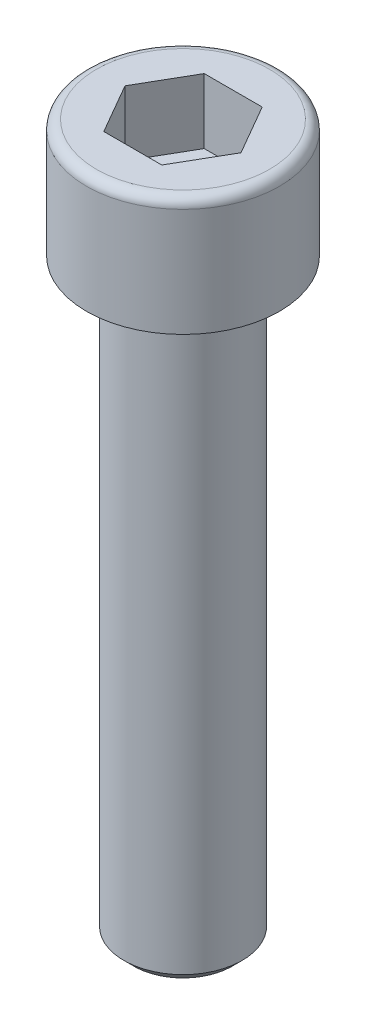
ISO-10303-21;
HEADER;
FILE_DESCRIPTION(('STEP AP214'),'2;1');
FILE_NAME('part.step','',(''),(''),'','','');
FILE_SCHEMA(('AUTOMOTIVE_DESIGN { 1 0 10303 214 1 1 1 1 }'));
ENDSEC;
DATA;
#1=APPLICATION_CONTEXT('core data for automotive mechanical design processes');
#2=APPLICATION_PROTOCOL_DEFINITION('international standard','automotive_design',2000,#1);
#3=PRODUCT_CONTEXT('',#1,'mechanical');
#4=PRODUCT('Part','Part','',(#3));
#5=PRODUCT_RELATED_PRODUCT_CATEGORY('part','',(#4));
#6=PRODUCT_DEFINITION_FORMATION('','',#4);
#7=PRODUCT_DEFINITION_CONTEXT('part definition',#1,'design');
#8=PRODUCT_DEFINITION('design','',#6,#7);
#9=PRODUCT_DEFINITION_SHAPE('','',#8);
#10=(LENGTH_UNIT() NAMED_UNIT(*) SI_UNIT(.MILLI.,.METRE.));
#11=(NAMED_UNIT(*) PLANE_ANGLE_UNIT() SI_UNIT($,.RADIAN.));
#12=(NAMED_UNIT(*) SI_UNIT($,.STERADIAN.) SOLID_ANGLE_UNIT());
#13=UNCERTAINTY_MEASURE_WITH_UNIT(LENGTH_MEASURE(1.E-05),#10,'distance_accuracy_value','');
#14=(GEOMETRIC_REPRESENTATION_CONTEXT(3) GLOBAL_UNCERTAINTY_ASSIGNED_CONTEXT((#13)) GLOBAL_UNIT_ASSIGNED_CONTEXT((#10,
#11,#12)) REPRESENTATION_CONTEXT('',''));
#15=CARTESIAN_POINT('',(0.,0.,0.));
#16=DIRECTION('',(0.,0.,1.));
#17=DIRECTION('',(1.,0.,0.));
#18=AXIS2_PLACEMENT_3D('',#15,#16,#17);
#19=CARTESIAN_POINT('',(0.,0.,0.));
#20=DIRECTION('',(0.,-1.,0.));
#21=DIRECTION('',(0.,0.,-1.));
#22=AXIS2_PLACEMENT_3D('',#19,#20,#21);
#23=PLANE('',#22);
#24=CARTESIAN_POINT('',(0.,0.,0.));
#25=DIRECTION('',(0.,-1.,0.));
#26=DIRECTION('',(0.,0.,-1.));
#27=AXIS2_PLACEMENT_3D('',#24,#25,#26);
#28=CIRCLE('',#27,4.9);
#29=CARTESIAN_POINT('',(0.,0.,-4.9));
#30=VERTEX_POINT('',#29);
#31=EDGE_CURVE('E142',#30,#30,#28,.T.);
#32=ORIENTED_EDGE('',*,*,#31,.T.);
#33=EDGE_LOOP('',(#32));
#34=FACE_BOUND('',#33,.T.);
#35=CARTESIAN_POINT('',(0.,0.,0.));
#36=DIRECTION('',(0.,-1.,0.));
#37=DIRECTION('',(0.,0.,-1.));
#38=AXIS2_PLACEMENT_3D('',#35,#36,#37);
#39=CIRCLE('',#38,3.);
#40=CARTESIAN_POINT('',(0.,0.,-3.));
#41=VERTEX_POINT('',#40);
#42=EDGE_CURVE('E134',#41,#41,#39,.T.);
#43=ORIENTED_EDGE('',*,*,#42,.F.);
#44=EDGE_LOOP('',(#43));
#45=FACE_BOUND('',#44,.T.);
#46=ADVANCED_FACE('F32',(#34,#45),#23,.T.);
#47=CARTESIAN_POINT('',(0.,6.,0.));
#48=DIRECTION('',(0.,-1.,0.));
#49=DIRECTION('',(0.,0.,-1.));
#50=AXIS2_PLACEMENT_3D('',#47,#48,#49);
#51=CYLINDRICAL_SURFACE('',#50,4.9);
#52=CARTESIAN_POINT('',(0.,5.5,0.));
#53=DIRECTION('',(0.,1.,0.));
#54=DIRECTION('',(0.,0.,1.));
#55=AXIS2_PLACEMENT_3D('',#52,#53,#54);
#56=CIRCLE('',#55,4.9);
#57=CARTESIAN_POINT('',(0.,5.5,4.9));
#58=VERTEX_POINT('',#57);
#59=EDGE_CURVE('E40',#58,#58,#56,.F.);
#60=ORIENTED_EDGE('',*,*,#59,.T.);
#61=EDGE_LOOP('',(#60));
#62=FACE_BOUND('',#61,.T.);
#63=ORIENTED_EDGE('',*,*,#31,.F.);
#64=EDGE_LOOP('',(#63));
#65=FACE_BOUND('',#64,.T.);
#66=ADVANCED_FACE('F153',(#62,#65),#51,.T.);
#67=CARTESIAN_POINT('',(4.9,6.,0.));
#68=DIRECTION('',(0.,1.,0.));
#69=DIRECTION('',(0.,0.,1.));
#70=AXIS2_PLACEMENT_3D('',#67,#68,#69);
#71=PLANE('',#70);
#72=CARTESIAN_POINT('',(0.,6.,0.));
#73=DIRECTION('',(0.,1.,0.));
#74=DIRECTION('',(0.,0.,1.));
#75=AXIS2_PLACEMENT_3D('',#72,#73,#74);
#76=CIRCLE('',#75,4.4);
#77=CARTESIAN_POINT('',(0.,6.,4.4));
#78=VERTEX_POINT('',#77);
#79=EDGE_CURVE('E11',#78,#78,#76,.T.);
#80=ORIENTED_EDGE('',*,*,#79,.T.);
#81=EDGE_LOOP('',(#80));
#82=FACE_BOUND('',#81,.T.);
#83=DIRECTION('',(0.499999999999999,0.,0.866025403784439));
#84=VECTOR('',#83,1.);
#85=CARTESIAN_POINT('',(-2.94448637286709,6.,0.));
#86=LINE('',#85,#84);
#87=CARTESIAN_POINT('',(-2.94448637286709,6.,0.));
#88=VERTEX_POINT('',#87);
#89=CARTESIAN_POINT('',(-1.47224318643355,6.,2.55));
#90=VERTEX_POINT('',#89);
#91=EDGE_CURVE('E47',#88,#90,#86,.T.);
#92=ORIENTED_EDGE('',*,*,#91,.F.);
#93=DIRECTION('',(-0.5,0.,0.866025403784439));
#94=VECTOR('',#93,1.);
#95=CARTESIAN_POINT('',(-1.47224318643354,6.,-2.55));
#96=LINE('',#95,#94);
#97=CARTESIAN_POINT('',(-1.47224318643354,6.,-2.55));
#98=VERTEX_POINT('',#97);
#99=EDGE_CURVE('E130',#98,#88,#96,.T.);
#100=ORIENTED_EDGE('',*,*,#99,.F.);
#101=DIRECTION('',(-1.,0.,0.));
#102=VECTOR('',#101,1.);
#103=CARTESIAN_POINT('',(1.47224318643355,6.,-2.55));
#104=LINE('',#103,#102);
#105=CARTESIAN_POINT('',(1.47224318643355,6.,-2.55));
#106=VERTEX_POINT('',#105);
#107=EDGE_CURVE('E128',#106,#98,#104,.T.);
#108=ORIENTED_EDGE('',*,*,#107,.F.);
#109=DIRECTION('',(-0.5,0.,-0.866025403784439));
#110=VECTOR('',#109,1.);
#111=CARTESIAN_POINT('',(2.94448637286709,6.,0.));
#112=LINE('',#111,#110);
#113=CARTESIAN_POINT('',(2.94448637286709,6.,0.));
#114=VERTEX_POINT('',#113);
#115=EDGE_CURVE('E95',#114,#106,#112,.T.);
#116=ORIENTED_EDGE('',*,*,#115,.F.);
#117=DIRECTION('',(0.5,0.,-0.866025403784439));
#118=VECTOR('',#117,1.);
#119=CARTESIAN_POINT('',(1.47224318643354,6.,2.55));
#120=LINE('',#119,#118);
#121=CARTESIAN_POINT('',(1.47224318643354,6.,2.55));
#122=VERTEX_POINT('',#121);
#123=EDGE_CURVE('E124',#122,#114,#120,.T.);
#124=ORIENTED_EDGE('',*,*,#123,.F.);
#125=DIRECTION('',(1.,0.,0.));
#126=VECTOR('',#125,1.);
#127=CARTESIAN_POINT('',(-1.47224318643355,6.,2.55));
#128=LINE('',#127,#126);
#129=EDGE_CURVE('E121',#90,#122,#128,.T.);
#130=ORIENTED_EDGE('',*,*,#129,.F.);
#131=EDGE_LOOP('',(#92,#100,#108,#116,#124,#130));
#132=FACE_BOUND('',#131,.T.);
#133=ADVANCED_FACE('F170',(#82,#132),#71,.T.);
#134=CARTESIAN_POINT('',(0.,-30.,0.));
#135=DIRECTION('',(0.,1.,0.));
#136=DIRECTION('',(0.,0.,1.));
#137=AXIS2_PLACEMENT_3D('',#134,#135,#136);
#138=CYLINDRICAL_SURFACE('',#137,3.);
#139=CARTESIAN_POINT('',(0.,-29.5,0.));
#140=DIRECTION('',(0.,-1.,0.));
#141=DIRECTION('',(0.,0.,-1.));
#142=AXIS2_PLACEMENT_3D('',#139,#140,#141);
#143=CIRCLE('',#142,3.);
#144=CARTESIAN_POINT('',(0.,-29.5,-3.));
#145=VERTEX_POINT('',#144);
#146=EDGE_CURVE('E148',#145,#145,#143,.F.);
#147=ORIENTED_EDGE('',*,*,#146,.T.);
#148=EDGE_LOOP('',(#147));
#149=FACE_BOUND('',#148,.T.);
#150=ORIENTED_EDGE('',*,*,#42,.T.);
#151=EDGE_LOOP('',(#150));
#152=FACE_BOUND('',#151,.T.);
#153=ADVANCED_FACE('F175',(#149,#152),#138,.T.);
#154=CARTESIAN_POINT('',(0.,-30.,0.));
#155=DIRECTION('',(0.,-1.,0.));
#156=DIRECTION('',(0.,0.,-1.));
#157=AXIS2_PLACEMENT_3D('',#154,#155,#156);
#158=PLANE('',#157);
#159=CARTESIAN_POINT('',(0.,-30.,0.));
#160=DIRECTION('',(0.,-1.,0.));
#161=DIRECTION('',(0.,0.,-1.));
#162=AXIS2_PLACEMENT_3D('',#159,#160,#161);
#163=CIRCLE('',#162,2.50000000000001);
#164=CARTESIAN_POINT('',(0.,-30.,-2.50000000000001));
#165=VERTEX_POINT('',#164);
#166=EDGE_CURVE('E145',#165,#165,#163,.T.);
#167=ORIENTED_EDGE('',*,*,#166,.T.);
#168=EDGE_LOOP('',(#167));
#169=FACE_BOUND('',#168,.T.);
#170=ADVANCED_FACE('F182',(#169),#158,.T.);
#171=CARTESIAN_POINT('',(-2.94448637286709,2.7,0.));
#172=DIRECTION('',(-0.866025403784439,0.,0.5));
#173=DIRECTION('',(0.5,0.,0.866025403784439));
#174=AXIS2_PLACEMENT_3D('',#171,#172,#173);
#175=PLANE('',#174);
#176=ORIENTED_EDGE('',*,*,#91,.T.);
#177=DIRECTION('',(0.,1.,0.));
#178=VECTOR('',#177,1.);
#179=CARTESIAN_POINT('',(-1.47224318643355,2.7,2.55));
#180=LINE('',#179,#178);
#181=CARTESIAN_POINT('',(-1.47224318643355,2.7,2.55));
#182=VERTEX_POINT('',#181);
#183=EDGE_CURVE('E77',#182,#90,#180,.T.);
#184=ORIENTED_EDGE('',*,*,#183,.F.);
#185=DIRECTION('',(0.499999999999999,0.,0.866025403784439));
#186=VECTOR('',#185,1.);
#187=CARTESIAN_POINT('',(-2.94448637286709,2.7,0.));
#188=LINE('',#187,#186);
#189=CARTESIAN_POINT('',(-2.94448637286709,2.7,0.));
#190=VERTEX_POINT('',#189);
#191=EDGE_CURVE('E132',#190,#182,#188,.T.);
#192=ORIENTED_EDGE('',*,*,#191,.F.);
#193=DIRECTION('',(0.,1.,0.));
#194=VECTOR('',#193,1.);
#195=CARTESIAN_POINT('',(-2.94448637286709,2.7,0.));
#196=LINE('',#195,#194);
#197=EDGE_CURVE('E55',#190,#88,#196,.T.);
#198=ORIENTED_EDGE('',*,*,#197,.T.);
#199=EDGE_LOOP('',(#176,#184,#192,#198));
#200=FACE_BOUND('',#199,.T.);
#201=ADVANCED_FACE('F191',(#200),#175,.F.);
#202=CARTESIAN_POINT('',(-1.47224318643354,2.7,-2.55));
#203=DIRECTION('',(-0.866025403784439,0.,-0.5));
#204=DIRECTION('',(-0.5,0.,0.866025403784439));
#205=AXIS2_PLACEMENT_3D('',#202,#203,#204);
#206=PLANE('',#205);
#207=ORIENTED_EDGE('',*,*,#99,.T.);
#208=ORIENTED_EDGE('',*,*,#197,.F.);
#209=DIRECTION('',(-0.5,0.,0.866025403784439));
#210=VECTOR('',#209,1.);
#211=CARTESIAN_POINT('',(-1.47224318643354,2.7,-2.55));
#212=LINE('',#211,#210);
#213=CARTESIAN_POINT('',(-1.47224318643354,2.7,-2.55));
#214=VERTEX_POINT('',#213);
#215=EDGE_CURVE('E107',#214,#190,#212,.T.);
#216=ORIENTED_EDGE('',*,*,#215,.F.);
#217=DIRECTION('',(0.,1.,0.));
#218=VECTOR('',#217,1.);
#219=CARTESIAN_POINT('',(-1.47224318643354,2.7,-2.55));
#220=LINE('',#219,#218);
#221=EDGE_CURVE('E99',#214,#98,#220,.T.);
#222=ORIENTED_EDGE('',*,*,#221,.T.);
#223=EDGE_LOOP('',(#207,#208,#216,#222));
#224=FACE_BOUND('',#223,.T.);
#225=ADVANCED_FACE('F193',(#224),#206,.F.);
#226=CARTESIAN_POINT('',(1.47224318643355,2.7,-2.55));
#227=DIRECTION('',(0.,0.,-1.));
#228=DIRECTION('',(-1.,0.,0.));
#229=AXIS2_PLACEMENT_3D('',#226,#227,#228);
#230=PLANE('',#229);
#231=ORIENTED_EDGE('',*,*,#107,.T.);
#232=ORIENTED_EDGE('',*,*,#221,.F.);
#233=DIRECTION('',(-1.,0.,0.));
#234=VECTOR('',#233,1.);
#235=CARTESIAN_POINT('',(1.47224318643355,2.7,-2.55));
#236=LINE('',#235,#234);
#237=CARTESIAN_POINT('',(1.47224318643355,2.7,-2.55));
#238=VERTEX_POINT('',#237);
#239=EDGE_CURVE('E103',#238,#214,#236,.T.);
#240=ORIENTED_EDGE('',*,*,#239,.F.);
#241=DIRECTION('',(0.,1.,0.));
#242=VECTOR('',#241,1.);
#243=CARTESIAN_POINT('',(1.47224318643355,2.7,-2.55));
#244=LINE('',#243,#242);
#245=EDGE_CURVE('E88',#238,#106,#244,.T.);
#246=ORIENTED_EDGE('',*,*,#245,.T.);
#247=EDGE_LOOP('',(#231,#232,#240,#246));
#248=FACE_BOUND('',#247,.T.);
#249=ADVANCED_FACE('F104',(#248),#230,.F.);
#250=CARTESIAN_POINT('',(2.94448637286709,2.7,0.));
#251=DIRECTION('',(0.866025403784439,0.,-0.5));
#252=DIRECTION('',(-0.5,0.,-0.866025403784439));
#253=AXIS2_PLACEMENT_3D('',#250,#251,#252);
#254=PLANE('',#253);
#255=ORIENTED_EDGE('',*,*,#115,.T.);
#256=ORIENTED_EDGE('',*,*,#245,.F.);
#257=DIRECTION('',(-0.5,0.,-0.866025403784439));
#258=VECTOR('',#257,1.);
#259=CARTESIAN_POINT('',(2.94448637286709,2.7,0.));
#260=LINE('',#259,#258);
#261=CARTESIAN_POINT('',(2.94448637286709,2.7,0.));
#262=VERTEX_POINT('',#261);
#263=EDGE_CURVE('E92',#262,#238,#260,.T.);
#264=ORIENTED_EDGE('',*,*,#263,.F.);
#265=DIRECTION('',(0.,1.,0.));
#266=VECTOR('',#265,1.);
#267=CARTESIAN_POINT('',(2.94448637286709,2.7,0.));
#268=LINE('',#267,#266);
#269=EDGE_CURVE('E100',#262,#114,#268,.T.);
#270=ORIENTED_EDGE('',*,*,#269,.T.);
#271=EDGE_LOOP('',(#255,#256,#264,#270));
#272=FACE_BOUND('',#271,.T.);
#273=ADVANCED_FACE('F90',(#272),#254,.F.);
#274=CARTESIAN_POINT('',(1.47224318643354,2.7,2.55));
#275=DIRECTION('',(0.866025403784439,0.,0.5));
#276=DIRECTION('',(0.5,0.,-0.866025403784439));
#277=AXIS2_PLACEMENT_3D('',#274,#275,#276);
#278=PLANE('',#277);
#279=ORIENTED_EDGE('',*,*,#123,.T.);
#280=ORIENTED_EDGE('',*,*,#269,.F.);
#281=DIRECTION('',(0.5,0.,-0.866025403784439));
#282=VECTOR('',#281,1.);
#283=CARTESIAN_POINT('',(1.47224318643354,2.7,2.55));
#284=LINE('',#283,#282);
#285=CARTESIAN_POINT('',(1.47224318643354,2.7,2.55));
#286=VERTEX_POINT('',#285);
#287=EDGE_CURVE('E113',#286,#262,#284,.T.);
#288=ORIENTED_EDGE('',*,*,#287,.F.);
#289=DIRECTION('',(0.,1.,0.));
#290=VECTOR('',#289,1.);
#291=CARTESIAN_POINT('',(1.47224318643354,2.7,2.55));
#292=LINE('',#291,#290);
#293=EDGE_CURVE('E137',#286,#122,#292,.T.);
#294=ORIENTED_EDGE('',*,*,#293,.T.);
#295=EDGE_LOOP('',(#279,#280,#288,#294));
#296=FACE_BOUND('',#295,.T.);
#297=ADVANCED_FACE('F204',(#296),#278,.F.);
#298=CARTESIAN_POINT('',(-1.47224318643355,2.7,2.55));
#299=DIRECTION('',(0.,0.,1.));
#300=DIRECTION('',(1.,0.,0.));
#301=AXIS2_PLACEMENT_3D('',#298,#299,#300);
#302=PLANE('',#301);
#303=ORIENTED_EDGE('',*,*,#129,.T.);
#304=ORIENTED_EDGE('',*,*,#293,.F.);
#305=DIRECTION('',(1.,0.,0.));
#306=VECTOR('',#305,1.);
#307=CARTESIAN_POINT('',(-1.47224318643355,2.7,2.55));
#308=LINE('',#307,#306);
#309=EDGE_CURVE('E115',#182,#286,#308,.T.);
#310=ORIENTED_EDGE('',*,*,#309,.F.);
#311=ORIENTED_EDGE('',*,*,#183,.T.);
#312=EDGE_LOOP('',(#303,#304,#310,#311));
#313=FACE_BOUND('',#312,.T.);
#314=ADVANCED_FACE('F189',(#313),#302,.F.);
#315=CARTESIAN_POINT('',(0.,2.7,0.));
#316=DIRECTION('',(0.,1.,0.));
#317=DIRECTION('',(0.,0.,1.));
#318=AXIS2_PLACEMENT_3D('',#315,#316,#317);
#319=PLANE('',#318);
#320=ORIENTED_EDGE('',*,*,#191,.T.);
#321=ORIENTED_EDGE('',*,*,#309,.T.);
#322=ORIENTED_EDGE('',*,*,#287,.T.);
#323=ORIENTED_EDGE('',*,*,#263,.T.);
#324=ORIENTED_EDGE('',*,*,#239,.T.);
#325=ORIENTED_EDGE('',*,*,#215,.T.);
#326=EDGE_LOOP('',(#320,#321,#322,#323,#324,#325));
#327=FACE_BOUND('',#326,.T.);
#328=ADVANCED_FACE('F110',(#327),#319,.T.);
#329=CARTESIAN_POINT('',(0.,-30.,0.));
#330=DIRECTION('',(0.,1.,0.));
#331=DIRECTION('',(0.,0.,1.));
#332=AXIS2_PLACEMENT_3D('',#329,#330,#331);
#333=CONICAL_SURFACE('',#332,2.50000000000001,0.785398163397442);
#334=ORIENTED_EDGE('',*,*,#146,.F.);
#335=EDGE_LOOP('',(#334));
#336=FACE_BOUND('',#335,.T.);
#337=ORIENTED_EDGE('',*,*,#166,.F.);
#338=EDGE_LOOP('',(#337));
#339=FACE_BOUND('',#338,.T.);
#340=ADVANCED_FACE('F157',(#336,#339),#333,.T.);
#341=CARTESIAN_POINT('',(0.,5.5,0.));
#342=DIRECTION('',(0.,1.,0.));
#343=DIRECTION('',(0.,0.,1.));
#344=AXIS2_PLACEMENT_3D('',#341,#342,#343);
#345=TOROIDAL_SURFACE('',#344,4.4,0.5);
#346=ORIENTED_EDGE('',*,*,#79,.F.);
#347=EDGE_LOOP('',(#346));
#348=FACE_BOUND('',#347,.T.);
#349=ORIENTED_EDGE('',*,*,#59,.F.);
#350=EDGE_LOOP('',(#349));
#351=FACE_BOUND('',#350,.T.);
#352=ADVANCED_FACE('F34',(#348,#351),#345,.T.);
#353=CLOSED_SHELL('',(#46,#66,#133,#153,#170,#201,#225,#249,#273,#297,#314,#328,#340,#352));
#354=MANIFOLD_SOLID_BREP('B2',#353);
#355=ADVANCED_BREP_SHAPE_REPRESENTATION('',(#18,#354),#14);
#356=SHAPE_DEFINITION_REPRESENTATION(#9,#355);
ENDSEC;
END-ISO-10303-21;
